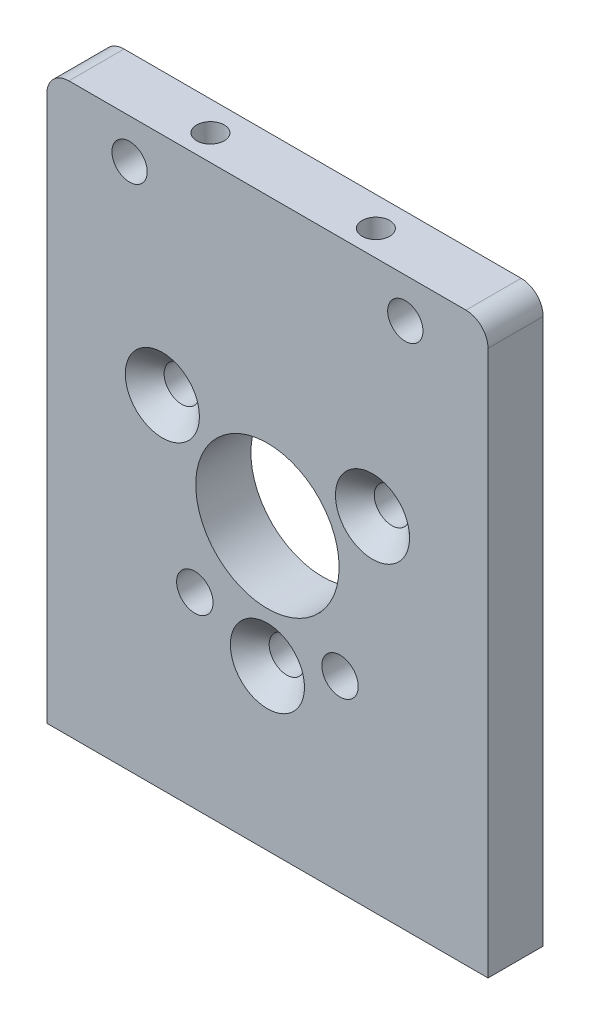
ISO-10303-21;
HEADER;
FILE_DESCRIPTION(('STEP AP214'),'2;1');
FILE_NAME('part.step','',(''),(''),'','','');
FILE_SCHEMA(('AUTOMOTIVE_DESIGN { 1 0 10303 214 1 1 1 1 }'));
ENDSEC;
DATA;
#1=APPLICATION_CONTEXT('core data for automotive mechanical design processes');
#2=APPLICATION_PROTOCOL_DEFINITION('international standard','automotive_design',2000,#1);
#3=PRODUCT_CONTEXT('',#1,'mechanical');
#4=PRODUCT('Part','Part','',(#3));
#5=PRODUCT_RELATED_PRODUCT_CATEGORY('part','',(#4));
#6=PRODUCT_DEFINITION_FORMATION('','',#4);
#7=PRODUCT_DEFINITION_CONTEXT('part definition',#1,'design');
#8=PRODUCT_DEFINITION('design','',#6,#7);
#9=PRODUCT_DEFINITION_SHAPE('','',#8);
#10=(LENGTH_UNIT() NAMED_UNIT(*) SI_UNIT(.MILLI.,.METRE.));
#11=(NAMED_UNIT(*) PLANE_ANGLE_UNIT() SI_UNIT($,.RADIAN.));
#12=(NAMED_UNIT(*) SI_UNIT($,.STERADIAN.) SOLID_ANGLE_UNIT());
#13=UNCERTAINTY_MEASURE_WITH_UNIT(LENGTH_MEASURE(1.E-05),#10,'distance_accuracy_value','');
#14=(GEOMETRIC_REPRESENTATION_CONTEXT(3) GLOBAL_UNCERTAINTY_ASSIGNED_CONTEXT((#13)) GLOBAL_UNIT_ASSIGNED_CONTEXT((#10,
#11,#12)) REPRESENTATION_CONTEXT('',''));
#15=CARTESIAN_POINT('',(0.,0.,0.));
#16=DIRECTION('',(0.,0.,1.));
#17=DIRECTION('',(1.,0.,0.));
#18=AXIS2_PLACEMENT_3D('',#15,#16,#17);
#19=CARTESIAN_POINT('',(-20.,51.4407699061603,5.));
#20=DIRECTION('',(0.,-1.,0.));
#21=DIRECTION('',(0.,0.,-1.));
#22=AXIS2_PLACEMENT_3D('',#19,#20,#21);
#23=PLANE('',#22);
#24=CARTESIAN_POINT('',(-7.5,51.4407699061603,2.66763659630348));
#25=DIRECTION('',(0.,1.,0.));
#26=DIRECTION('',(0.,0.,1.));
#27=AXIS2_PLACEMENT_3D('',#24,#25,#26);
#28=CIRCLE('',#27,1.25);
#29=CARTESIAN_POINT('',(-7.5,51.4407699061603,3.91763659630348));
#30=VERTEX_POINT('',#29);
#31=EDGE_CURVE('E118',#30,#30,#28,.T.);
#32=ORIENTED_EDGE('',*,*,#31,.F.);
#33=EDGE_LOOP('',(#32));
#34=FACE_BOUND('',#33,.T.);
#35=DIRECTION('',(-1.,0.,0.));
#36=VECTOR('',#35,1.);
#37=CARTESIAN_POINT('',(-20.,51.4407699061603,0.));
#38=LINE('',#37,#36);
#39=CARTESIAN_POINT('',(18.,51.4407699061603,0.));
#40=VERTEX_POINT('',#39);
#41=CARTESIAN_POINT('',(-18.,51.4407699061603,0.));
#42=VERTEX_POINT('',#41);
#43=EDGE_CURVE('E195',#40,#42,#38,.T.);
#44=ORIENTED_EDGE('',*,*,#43,.T.);
#45=DIRECTION('',(0.,0.,-1.));
#46=VECTOR('',#45,1.);
#47=CARTESIAN_POINT('',(-18.,51.4407699061603,5.));
#48=LINE('',#47,#46);
#49=CARTESIAN_POINT('',(-18.,51.4407699061603,5.));
#50=VERTEX_POINT('',#49);
#51=EDGE_CURVE('E63',#42,#50,#48,.F.);
#52=ORIENTED_EDGE('',*,*,#51,.T.);
#53=DIRECTION('',(-1.,0.,0.));
#54=VECTOR('',#53,1.);
#55=CARTESIAN_POINT('',(-20.,51.4407699061603,5.));
#56=LINE('',#55,#54);
#57=CARTESIAN_POINT('',(18.,51.4407699061603,5.));
#58=VERTEX_POINT('',#57);
#59=EDGE_CURVE('E198',#58,#50,#56,.T.);
#60=ORIENTED_EDGE('',*,*,#59,.F.);
#61=DIRECTION('',(0.,0.,-1.));
#62=VECTOR('',#61,1.);
#63=CARTESIAN_POINT('',(18.,51.4407699061603,5.));
#64=LINE('',#63,#62);
#65=EDGE_CURVE('E226',#58,#40,#64,.T.);
#66=ORIENTED_EDGE('',*,*,#65,.T.);
#67=EDGE_LOOP('',(#44,#52,#60,#66));
#68=FACE_BOUND('',#67,.T.);
#69=CARTESIAN_POINT('',(7.5,51.4407699061603,2.66763659630348));
#70=DIRECTION('',(0.,1.,0.));
#71=DIRECTION('',(0.,0.,1.));
#72=AXIS2_PLACEMENT_3D('',#69,#70,#71);
#73=CIRCLE('',#72,1.25);
#74=CARTESIAN_POINT('',(7.5,51.4407699061603,3.91763659630348));
#75=VERTEX_POINT('',#74);
#76=EDGE_CURVE('E117',#75,#75,#73,.T.);
#77=ORIENTED_EDGE('',*,*,#76,.F.);
#78=EDGE_LOOP('',(#77));
#79=FACE_BOUND('',#78,.T.);
#80=ADVANCED_FACE('F42',(#34,#68,#79),#23,.F.);
#81=CARTESIAN_POINT('',(-9.52627944162884,31.,5.));
#82=DIRECTION('',(0.,0.,-1.));
#83=DIRECTION('',(-1.,0.,0.));
#84=AXIS2_PLACEMENT_3D('',#81,#82,#83);
#85=CYLINDRICAL_SURFACE('',#84,1.6);
#86=CARTESIAN_POINT('',(-9.52627944162884,31.,0.));
#87=DIRECTION('',(0.,0.,1.));
#88=DIRECTION('',(1.,0.,0.));
#89=AXIS2_PLACEMENT_3D('',#86,#87,#88);
#90=CIRCLE('',#89,1.6);
#91=CARTESIAN_POINT('',(-7.92627944162884,31.,0.));
#92=VERTEX_POINT('',#91);
#93=EDGE_CURVE('E185',#92,#92,#90,.T.);
#94=ORIENTED_EDGE('',*,*,#93,.F.);
#95=EDGE_LOOP('',(#94));
#96=FACE_BOUND('',#95,.T.);
#97=CARTESIAN_POINT('',(-9.52627944162884,31.,3.24));
#98=DIRECTION('',(0.,0.,1.));
#99=DIRECTION('',(1.,0.,0.));
#100=AXIS2_PLACEMENT_3D('',#97,#98,#99);
#101=CIRCLE('',#100,1.6);
#102=CARTESIAN_POINT('',(-7.92627944162884,31.,3.24));
#103=VERTEX_POINT('',#102);
#104=EDGE_CURVE('E143',#103,#103,#101,.T.);
#105=ORIENTED_EDGE('',*,*,#104,.T.);
#106=EDGE_LOOP('',(#105));
#107=FACE_BOUND('',#106,.T.);
#108=ADVANCED_FACE('F271',(#96,#107),#85,.F.);
#109=CARTESIAN_POINT('',(9.52627944162884,31.,5.));
#110=DIRECTION('',(0.,0.,-1.));
#111=DIRECTION('',(-1.,0.,0.));
#112=AXIS2_PLACEMENT_3D('',#109,#110,#111);
#113=CYLINDRICAL_SURFACE('',#112,1.6);
#114=CARTESIAN_POINT('',(9.52627944162884,31.,0.));
#115=DIRECTION('',(0.,0.,1.));
#116=DIRECTION('',(-1.,0.,0.));
#117=AXIS2_PLACEMENT_3D('',#114,#115,#116);
#118=CIRCLE('',#117,1.6);
#119=CARTESIAN_POINT('',(7.92627944162884,31.,0.));
#120=VERTEX_POINT('',#119);
#121=EDGE_CURVE('E180',#120,#120,#118,.T.);
#122=ORIENTED_EDGE('',*,*,#121,.F.);
#123=EDGE_LOOP('',(#122));
#124=FACE_BOUND('',#123,.T.);
#125=CARTESIAN_POINT('',(9.52627944162884,31.,3.24));
#126=DIRECTION('',(0.,0.,1.));
#127=DIRECTION('',(1.,0.,0.));
#128=AXIS2_PLACEMENT_3D('',#125,#126,#127);
#129=CIRCLE('',#128,1.6);
#130=CARTESIAN_POINT('',(11.1262794416288,31.,3.24));
#131=VERTEX_POINT('',#130);
#132=EDGE_CURVE('E149',#131,#131,#129,.T.);
#133=ORIENTED_EDGE('',*,*,#132,.T.);
#134=EDGE_LOOP('',(#133));
#135=FACE_BOUND('',#134,.T.);
#136=ADVANCED_FACE('F277',(#124,#135),#113,.F.);
#137=CARTESIAN_POINT('',(0.,14.5,5.));
#138=DIRECTION('',(0.,0.,-1.));
#139=DIRECTION('',(-1.,0.,0.));
#140=AXIS2_PLACEMENT_3D('',#137,#138,#139);
#141=CYLINDRICAL_SURFACE('',#140,1.6);
#142=CARTESIAN_POINT('',(0.,14.5,0.));
#143=DIRECTION('',(0.,0.,1.));
#144=DIRECTION('',(1.,0.,0.));
#145=AXIS2_PLACEMENT_3D('',#142,#143,#144);
#146=CIRCLE('',#145,1.6);
#147=CARTESIAN_POINT('',(1.6,14.5,0.));
#148=VERTEX_POINT('',#147);
#149=EDGE_CURVE('E188',#148,#148,#146,.T.);
#150=ORIENTED_EDGE('',*,*,#149,.F.);
#151=EDGE_LOOP('',(#150));
#152=FACE_BOUND('',#151,.T.);
#153=CARTESIAN_POINT('',(0.,14.5,3.24));
#154=DIRECTION('',(0.,0.,1.));
#155=DIRECTION('',(1.,0.,0.));
#156=AXIS2_PLACEMENT_3D('',#153,#154,#155);
#157=CIRCLE('',#156,1.6);
#158=CARTESIAN_POINT('',(1.6,14.5,3.24));
#159=VERTEX_POINT('',#158);
#160=EDGE_CURVE('E155',#159,#159,#157,.T.);
#161=ORIENTED_EDGE('',*,*,#160,.T.);
#162=EDGE_LOOP('',(#161));
#163=FACE_BOUND('',#162,.T.);
#164=ADVANCED_FACE('F322',(#152,#163),#141,.F.);
#165=CARTESIAN_POINT('',(0.,0.,5.));
#166=DIRECTION('',(0.,0.,-1.));
#167=DIRECTION('',(-1.,0.,0.));
#168=AXIS2_PLACEMENT_3D('',#165,#166,#167);
#169=PLANE('',#168);
#170=CARTESIAN_POINT('',(-9.52627944162884,31.,5.));
#171=DIRECTION('',(0.,0.,1.));
#172=DIRECTION('',(1.,0.,0.));
#173=AXIS2_PLACEMENT_3D('',#170,#171,#172);
#174=CIRCLE('',#173,3.36);
#175=CARTESIAN_POINT('',(-6.16627944162884,31.,5.));
#176=VERTEX_POINT('',#175);
#177=EDGE_CURVE('E140',#176,#176,#174,.T.);
#178=ORIENTED_EDGE('',*,*,#177,.F.);
#179=EDGE_LOOP('',(#178));
#180=FACE_BOUND('',#179,.T.);
#181=CARTESIAN_POINT('',(9.52627944162884,31.,5.));
#182=DIRECTION('',(0.,0.,1.));
#183=DIRECTION('',(1.,0.,0.));
#184=AXIS2_PLACEMENT_3D('',#181,#182,#183);
#185=CIRCLE('',#184,3.36);
#186=CARTESIAN_POINT('',(12.8862794416288,31.,5.));
#187=VERTEX_POINT('',#186);
#188=EDGE_CURVE('E146',#187,#187,#185,.T.);
#189=ORIENTED_EDGE('',*,*,#188,.F.);
#190=EDGE_LOOP('',(#189));
#191=FACE_BOUND('',#190,.T.);
#192=CARTESIAN_POINT('',(0.,14.5,5.));
#193=DIRECTION('',(0.,0.,1.));
#194=DIRECTION('',(1.,0.,0.));
#195=AXIS2_PLACEMENT_3D('',#192,#193,#194);
#196=CIRCLE('',#195,3.36);
#197=CARTESIAN_POINT('',(3.36,14.5,5.));
#198=VERTEX_POINT('',#197);
#199=EDGE_CURVE('E152',#198,#198,#196,.T.);
#200=ORIENTED_EDGE('',*,*,#199,.F.);
#201=EDGE_LOOP('',(#200));
#202=FACE_BOUND('',#201,.T.);
#203=CARTESIAN_POINT('',(6.58122329054409,17.,5.));
#204=DIRECTION('',(0.,0.,-1.));
#205=DIRECTION('',(-1.,0.,0.));
#206=AXIS2_PLACEMENT_3D('',#203,#204,#205);
#207=CIRCLE('',#206,1.64999999999999);
#208=CARTESIAN_POINT('',(4.9312232905441,17.,5.));
#209=VERTEX_POINT('',#208);
#210=EDGE_CURVE('E161',#209,#209,#207,.T.);
#211=ORIENTED_EDGE('',*,*,#210,.T.);
#212=EDGE_LOOP('',(#211));
#213=FACE_BOUND('',#212,.T.);
#214=CARTESIAN_POINT('',(-6.58122329054409,17.,5.));
#215=DIRECTION('',(0.,0.,-1.));
#216=DIRECTION('',(-1.,0.,0.));
#217=AXIS2_PLACEMENT_3D('',#214,#215,#216);
#218=CIRCLE('',#217,1.64999999999999);
#219=CARTESIAN_POINT('',(-8.23122329054408,17.,5.));
#220=VERTEX_POINT('',#219);
#221=EDGE_CURVE('E167',#220,#220,#218,.T.);
#222=ORIENTED_EDGE('',*,*,#221,.T.);
#223=EDGE_LOOP('',(#222));
#224=FACE_BOUND('',#223,.T.);
#225=ORIENTED_EDGE('',*,*,#59,.T.);
#226=CARTESIAN_POINT('',(-18.,49.4407699061603,5.));
#227=DIRECTION('',(0.,0.,-1.));
#228=DIRECTION('',(-1.,0.,0.));
#229=AXIS2_PLACEMENT_3D('',#226,#227,#228);
#230=CIRCLE('',#229,2.);
#231=CARTESIAN_POINT('',(-20.,49.4407699061603,5.));
#232=VERTEX_POINT('',#231);
#233=EDGE_CURVE('E50',#50,#232,#230,.F.);
#234=ORIENTED_EDGE('',*,*,#233,.T.);
#235=DIRECTION('',(0.,-1.,0.));
#236=VECTOR('',#235,1.);
#237=CARTESIAN_POINT('',(-20.,51.4407699061603,5.));
#238=LINE('',#237,#236);
#239=CARTESIAN_POINT('',(-20.,0.,5.));
#240=VERTEX_POINT('',#239);
#241=EDGE_CURVE('E200',#232,#240,#238,.T.);
#242=ORIENTED_EDGE('',*,*,#241,.T.);
#243=DIRECTION('',(1.,0.,0.));
#244=VECTOR('',#243,1.);
#245=CARTESIAN_POINT('',(-20.,0.,5.));
#246=LINE('',#245,#244);
#247=CARTESIAN_POINT('',(20.,0.,5.));
#248=VERTEX_POINT('',#247);
#249=EDGE_CURVE('E203',#240,#248,#246,.T.);
#250=ORIENTED_EDGE('',*,*,#249,.T.);
#251=DIRECTION('',(0.,1.,0.));
#252=VECTOR('',#251,1.);
#253=CARTESIAN_POINT('',(20.,51.4407699061603,5.));
#254=LINE('',#253,#252);
#255=CARTESIAN_POINT('',(20.,49.4407699061603,5.));
#256=VERTEX_POINT('',#255);
#257=EDGE_CURVE('E205',#248,#256,#254,.T.);
#258=ORIENTED_EDGE('',*,*,#257,.T.);
#259=CARTESIAN_POINT('',(18.,49.4407699061603,5.));
#260=DIRECTION('',(0.,0.,-1.));
#261=DIRECTION('',(-1.,0.,0.));
#262=AXIS2_PLACEMENT_3D('',#259,#260,#261);
#263=CIRCLE('',#262,2.);
#264=EDGE_CURVE('E230',#256,#58,#263,.F.);
#265=ORIENTED_EDGE('',*,*,#264,.T.);
#266=EDGE_LOOP('',(#225,#234,#242,#250,#258,#265));
#267=FACE_BOUND('',#266,.T.);
#268=CARTESIAN_POINT('',(0.,25.5,5.));
#269=DIRECTION('',(0.,0.,1.));
#270=DIRECTION('',(1.,0.,0.));
#271=AXIS2_PLACEMENT_3D('',#268,#269,#270);
#272=CIRCLE('',#271,6.5);
#273=CARTESIAN_POINT('',(6.50000000000001,25.5,5.));
#274=VERTEX_POINT('',#273);
#275=EDGE_CURVE('E192',#274,#274,#272,.T.);
#276=ORIENTED_EDGE('',*,*,#275,.F.);
#277=EDGE_LOOP('',(#276));
#278=FACE_BOUND('',#277,.T.);
#279=CARTESIAN_POINT('',(-12.5,47.8407699061604,5.));
#280=DIRECTION('',(0.,0.,1.));
#281=DIRECTION('',(1.,0.,0.));
#282=AXIS2_PLACEMENT_3D('',#279,#280,#281);
#283=CIRCLE('',#282,1.6);
#284=CARTESIAN_POINT('',(-10.9,47.8407699061604,5.));
#285=VERTEX_POINT('',#284);
#286=EDGE_CURVE('E177',#285,#285,#283,.T.);
#287=ORIENTED_EDGE('',*,*,#286,.F.);
#288=EDGE_LOOP('',(#287));
#289=FACE_BOUND('',#288,.T.);
#290=CARTESIAN_POINT('',(12.5,47.8407699061604,5.));
#291=DIRECTION('',(0.,0.,1.));
#292=DIRECTION('',(-1.,0.,0.));
#293=AXIS2_PLACEMENT_3D('',#290,#291,#292);
#294=CIRCLE('',#293,1.6);
#295=CARTESIAN_POINT('',(10.9,47.8407699061604,5.));
#296=VERTEX_POINT('',#295);
#297=EDGE_CURVE('E171',#296,#296,#294,.T.);
#298=ORIENTED_EDGE('',*,*,#297,.F.);
#299=EDGE_LOOP('',(#298));
#300=FACE_BOUND('',#299,.T.);
#301=ADVANCED_FACE('F234',(#180,#191,#202,#213,#224,#267,#278,#289,#300),#169,.F.);
#302=CARTESIAN_POINT('',(0.,0.,0.));
#303=DIRECTION('',(0.,0.,-1.));
#304=DIRECTION('',(-1.,0.,0.));
#305=AXIS2_PLACEMENT_3D('',#302,#303,#304);
#306=PLANE('',#305);
#307=CARTESIAN_POINT('',(6.58122329054409,17.,0.));
#308=DIRECTION('',(0.,0.,-1.));
#309=DIRECTION('',(-1.,0.,0.));
#310=AXIS2_PLACEMENT_3D('',#307,#308,#309);
#311=CIRCLE('',#310,1.64999999999999);
#312=CARTESIAN_POINT('',(4.9312232905441,17.,0.));
#313=VERTEX_POINT('',#312);
#314=EDGE_CURVE('E158',#313,#313,#311,.T.);
#315=ORIENTED_EDGE('',*,*,#314,.F.);
#316=EDGE_LOOP('',(#315));
#317=FACE_BOUND('',#316,.T.);
#318=CARTESIAN_POINT('',(-6.58122329054409,17.,0.));
#319=DIRECTION('',(0.,0.,-1.));
#320=DIRECTION('',(-1.,0.,0.));
#321=AXIS2_PLACEMENT_3D('',#318,#319,#320);
#322=CIRCLE('',#321,1.64999999999999);
#323=CARTESIAN_POINT('',(-8.23122329054408,17.,0.));
#324=VERTEX_POINT('',#323);
#325=EDGE_CURVE('E164',#324,#324,#322,.T.);
#326=ORIENTED_EDGE('',*,*,#325,.F.);
#327=EDGE_LOOP('',(#326));
#328=FACE_BOUND('',#327,.T.);
#329=CARTESIAN_POINT('',(-12.5,47.8407699061604,0.));
#330=DIRECTION('',(0.,0.,1.));
#331=DIRECTION('',(1.,0.,0.));
#332=AXIS2_PLACEMENT_3D('',#329,#330,#331);
#333=CIRCLE('',#332,1.6);
#334=CARTESIAN_POINT('',(-10.9,47.8407699061604,0.));
#335=VERTEX_POINT('',#334);
#336=EDGE_CURVE('E174',#335,#335,#333,.T.);
#337=ORIENTED_EDGE('',*,*,#336,.T.);
#338=EDGE_LOOP('',(#337));
#339=FACE_BOUND('',#338,.T.);
#340=ORIENTED_EDGE('',*,*,#93,.T.);
#341=EDGE_LOOP('',(#340));
#342=FACE_BOUND('',#341,.T.);
#343=CARTESIAN_POINT('',(0.,25.5,0.));
#344=DIRECTION('',(0.,0.,1.));
#345=DIRECTION('',(1.,0.,0.));
#346=AXIS2_PLACEMENT_3D('',#343,#344,#345);
#347=CIRCLE('',#346,6.5);
#348=CARTESIAN_POINT('',(6.50000000000001,25.5,0.));
#349=VERTEX_POINT('',#348);
#350=EDGE_CURVE('E191',#349,#349,#347,.T.);
#351=ORIENTED_EDGE('',*,*,#350,.T.);
#352=EDGE_LOOP('',(#351));
#353=FACE_BOUND('',#352,.T.);
#354=DIRECTION('',(0.,-1.,0.));
#355=VECTOR('',#354,1.);
#356=CARTESIAN_POINT('',(-20.,51.4407699061603,0.));
#357=LINE('',#356,#355);
#358=CARTESIAN_POINT('',(-20.,49.4407699061603,0.));
#359=VERTEX_POINT('',#358);
#360=CARTESIAN_POINT('',(-20.,0.,0.));
#361=VERTEX_POINT('',#360);
#362=EDGE_CURVE('E209',#359,#361,#357,.T.);
#363=ORIENTED_EDGE('',*,*,#362,.F.);
#364=CARTESIAN_POINT('',(-18.,49.4407699061603,0.));
#365=DIRECTION('',(0.,0.,-1.));
#366=DIRECTION('',(-1.,0.,0.));
#367=AXIS2_PLACEMENT_3D('',#364,#365,#366);
#368=CIRCLE('',#367,2.);
#369=EDGE_CURVE('E224',#359,#42,#368,.T.);
#370=ORIENTED_EDGE('',*,*,#369,.T.);
#371=ORIENTED_EDGE('',*,*,#43,.F.);
#372=CARTESIAN_POINT('',(18.,49.4407699061603,0.));
#373=DIRECTION('',(0.,0.,-1.));
#374=DIRECTION('',(-1.,0.,0.));
#375=AXIS2_PLACEMENT_3D('',#372,#373,#374);
#376=CIRCLE('',#375,2.);
#377=CARTESIAN_POINT('',(20.,49.4407699061603,0.));
#378=VERTEX_POINT('',#377);
#379=EDGE_CURVE('E222',#40,#378,#376,.T.);
#380=ORIENTED_EDGE('',*,*,#379,.T.);
#381=DIRECTION('',(0.,1.,0.));
#382=VECTOR('',#381,1.);
#383=CARTESIAN_POINT('',(20.,51.4407699061603,0.));
#384=LINE('',#383,#382);
#385=CARTESIAN_POINT('',(20.,0.,0.));
#386=VERTEX_POINT('',#385);
#387=EDGE_CURVE('E201',#386,#378,#384,.T.);
#388=ORIENTED_EDGE('',*,*,#387,.F.);
#389=DIRECTION('',(1.,0.,0.));
#390=VECTOR('',#389,1.);
#391=CARTESIAN_POINT('',(-20.,0.,0.));
#392=LINE('',#391,#390);
#393=EDGE_CURVE('E211',#361,#386,#392,.T.);
#394=ORIENTED_EDGE('',*,*,#393,.F.);
#395=EDGE_LOOP('',(#363,#370,#371,#380,#388,#394));
#396=FACE_BOUND('',#395,.T.);
#397=ORIENTED_EDGE('',*,*,#149,.T.);
#398=EDGE_LOOP('',(#397));
#399=FACE_BOUND('',#398,.T.);
#400=ORIENTED_EDGE('',*,*,#121,.T.);
#401=EDGE_LOOP('',(#400));
#402=FACE_BOUND('',#401,.T.);
#403=CARTESIAN_POINT('',(12.5,47.8407699061604,0.));
#404=DIRECTION('',(0.,0.,1.));
#405=DIRECTION('',(-1.,0.,0.));
#406=AXIS2_PLACEMENT_3D('',#403,#404,#405);
#407=CIRCLE('',#406,1.6);
#408=CARTESIAN_POINT('',(10.9,47.8407699061604,0.));
#409=VERTEX_POINT('',#408);
#410=EDGE_CURVE('E170',#409,#409,#407,.T.);
#411=ORIENTED_EDGE('',*,*,#410,.T.);
#412=EDGE_LOOP('',(#411));
#413=FACE_BOUND('',#412,.T.);
#414=ADVANCED_FACE('F246',(#317,#328,#339,#342,#353,#396,#399,#402,#413),#306,.T.);
#415=CARTESIAN_POINT('',(-20.,51.4407699061603,5.));
#416=DIRECTION('',(1.,0.,0.));
#417=DIRECTION('',(0.,1.,0.));
#418=AXIS2_PLACEMENT_3D('',#415,#416,#417);
#419=PLANE('',#418);
#420=ORIENTED_EDGE('',*,*,#241,.F.);
#421=DIRECTION('',(0.,0.,-1.));
#422=VECTOR('',#421,1.);
#423=CARTESIAN_POINT('',(-20.,49.4407699061603,5.));
#424=LINE('',#423,#422);
#425=EDGE_CURVE('E219',#232,#359,#424,.T.);
#426=ORIENTED_EDGE('',*,*,#425,.T.);
#427=ORIENTED_EDGE('',*,*,#362,.T.);
#428=DIRECTION('',(0.,0.,-1.));
#429=VECTOR('',#428,1.);
#430=CARTESIAN_POINT('',(-20.,0.,5.));
#431=LINE('',#430,#429);
#432=EDGE_CURVE('E216',#240,#361,#431,.T.);
#433=ORIENTED_EDGE('',*,*,#432,.F.);
#434=EDGE_LOOP('',(#420,#426,#427,#433));
#435=FACE_BOUND('',#434,.T.);
#436=ADVANCED_FACE('F240',(#435),#419,.F.);
#437=CARTESIAN_POINT('',(-20.,0.,5.));
#438=DIRECTION('',(0.,1.,0.));
#439=DIRECTION('',(0.,0.,1.));
#440=AXIS2_PLACEMENT_3D('',#437,#438,#439);
#441=PLANE('',#440);
#442=CARTESIAN_POINT('',(-16.,0.,2.5));
#443=DIRECTION('',(0.,-1.,0.));
#444=DIRECTION('',(0.,0.,-1.));
#445=AXIS2_PLACEMENT_3D('',#442,#443,#444);
#446=CIRCLE('',#445,1.25);
#447=CARTESIAN_POINT('',(-16.,0.,1.25));
#448=VERTEX_POINT('',#447);
#449=EDGE_CURVE('E128',#448,#448,#446,.T.);
#450=ORIENTED_EDGE('',*,*,#449,.F.);
#451=EDGE_LOOP('',(#450));
#452=FACE_BOUND('',#451,.T.);
#453=CARTESIAN_POINT('',(16.,0.,2.5));
#454=DIRECTION('',(0.,-1.,0.));
#455=DIRECTION('',(0.,0.,-1.));
#456=AXIS2_PLACEMENT_3D('',#453,#454,#455);
#457=CIRCLE('',#456,1.25);
#458=CARTESIAN_POINT('',(16.,0.,1.25));
#459=VERTEX_POINT('',#458);
#460=EDGE_CURVE('E134',#459,#459,#457,.T.);
#461=ORIENTED_EDGE('',*,*,#460,.F.);
#462=EDGE_LOOP('',(#461));
#463=FACE_BOUND('',#462,.T.);
#464=ORIENTED_EDGE('',*,*,#393,.T.);
#465=DIRECTION('',(0.,0.,-1.));
#466=VECTOR('',#465,1.);
#467=CARTESIAN_POINT('',(20.,0.,5.));
#468=LINE('',#467,#466);
#469=EDGE_CURVE('E207',#248,#386,#468,.T.);
#470=ORIENTED_EDGE('',*,*,#469,.F.);
#471=ORIENTED_EDGE('',*,*,#249,.F.);
#472=ORIENTED_EDGE('',*,*,#432,.T.);
#473=EDGE_LOOP('',(#464,#470,#471,#472));
#474=FACE_BOUND('',#473,.T.);
#475=ADVANCED_FACE('F257',(#452,#463,#474),#441,.F.);
#476=CARTESIAN_POINT('',(20.,51.4407699061603,5.));
#477=DIRECTION('',(-1.,0.,0.));
#478=DIRECTION('',(0.,-1.,0.));
#479=AXIS2_PLACEMENT_3D('',#476,#477,#478);
#480=PLANE('',#479);
#481=ORIENTED_EDGE('',*,*,#387,.T.);
#482=DIRECTION('',(0.,0.,-1.));
#483=VECTOR('',#482,1.);
#484=CARTESIAN_POINT('',(20.,49.4407699061603,5.));
#485=LINE('',#484,#483);
#486=EDGE_CURVE('E11',#378,#256,#485,.F.);
#487=ORIENTED_EDGE('',*,*,#486,.T.);
#488=ORIENTED_EDGE('',*,*,#257,.F.);
#489=ORIENTED_EDGE('',*,*,#469,.T.);
#490=EDGE_LOOP('',(#481,#487,#488,#489));
#491=FACE_BOUND('',#490,.T.);
#492=ADVANCED_FACE('F254',(#491),#480,.F.);
#493=CARTESIAN_POINT('',(0.,25.5,5.));
#494=DIRECTION('',(0.,0.,-1.));
#495=DIRECTION('',(-1.,0.,0.));
#496=AXIS2_PLACEMENT_3D('',#493,#494,#495);
#497=CYLINDRICAL_SURFACE('',#496,6.5);
#498=ORIENTED_EDGE('',*,*,#275,.T.);
#499=EDGE_LOOP('',(#498));
#500=FACE_BOUND('',#499,.T.);
#501=ORIENTED_EDGE('',*,*,#350,.F.);
#502=EDGE_LOOP('',(#501));
#503=FACE_BOUND('',#502,.T.);
#504=ADVANCED_FACE('F265',(#500,#503),#497,.F.);
#505=CARTESIAN_POINT('',(-12.5,47.8407699061604,5.));
#506=DIRECTION('',(0.,0.,-1.));
#507=DIRECTION('',(-1.,0.,0.));
#508=AXIS2_PLACEMENT_3D('',#505,#506,#507);
#509=CYLINDRICAL_SURFACE('',#508,1.6);
#510=ORIENTED_EDGE('',*,*,#286,.T.);
#511=EDGE_LOOP('',(#510));
#512=FACE_BOUND('',#511,.T.);
#513=ORIENTED_EDGE('',*,*,#336,.F.);
#514=EDGE_LOOP('',(#513));
#515=FACE_BOUND('',#514,.T.);
#516=ADVANCED_FACE('F316',(#512,#515),#509,.F.);
#517=CARTESIAN_POINT('',(12.5,47.8407699061604,5.));
#518=DIRECTION('',(0.,0.,-1.));
#519=DIRECTION('',(-1.,0.,0.));
#520=AXIS2_PLACEMENT_3D('',#517,#518,#519);
#521=CYLINDRICAL_SURFACE('',#520,1.6);
#522=ORIENTED_EDGE('',*,*,#297,.T.);
#523=EDGE_LOOP('',(#522));
#524=FACE_BOUND('',#523,.T.);
#525=ORIENTED_EDGE('',*,*,#410,.F.);
#526=EDGE_LOOP('',(#525));
#527=FACE_BOUND('',#526,.T.);
#528=ADVANCED_FACE('F312',(#524,#527),#521,.F.);
#529=CARTESIAN_POINT('',(-6.58122329054409,17.,0.));
#530=DIRECTION('',(0.,0.,-1.));
#531=DIRECTION('',(-1.,0.,0.));
#532=AXIS2_PLACEMENT_3D('',#529,#530,#531);
#533=CYLINDRICAL_SURFACE('',#532,1.64999999999999);
#534=ORIENTED_EDGE('',*,*,#221,.F.);
#535=EDGE_LOOP('',(#534));
#536=FACE_BOUND('',#535,.T.);
#537=ORIENTED_EDGE('',*,*,#325,.T.);
#538=EDGE_LOOP('',(#537));
#539=FACE_BOUND('',#538,.T.);
#540=ADVANCED_FACE('F308',(#536,#539),#533,.F.);
#541=CARTESIAN_POINT('',(6.58122329054409,17.,0.));
#542=DIRECTION('',(0.,0.,-1.));
#543=DIRECTION('',(-1.,0.,0.));
#544=AXIS2_PLACEMENT_3D('',#541,#542,#543);
#545=CYLINDRICAL_SURFACE('',#544,1.64999999999999);
#546=ORIENTED_EDGE('',*,*,#210,.F.);
#547=EDGE_LOOP('',(#546));
#548=FACE_BOUND('',#547,.T.);
#549=ORIENTED_EDGE('',*,*,#314,.T.);
#550=EDGE_LOOP('',(#549));
#551=FACE_BOUND('',#550,.T.);
#552=ADVANCED_FACE('F304',(#548,#551),#545,.F.);
#553=CARTESIAN_POINT('',(0.,14.5,5.));
#554=DIRECTION('',(0.,0.,1.));
#555=DIRECTION('',(1.,0.,0.));
#556=AXIS2_PLACEMENT_3D('',#553,#554,#555);
#557=CONICAL_SURFACE('',#556,3.36,0.785398163397449);
#558=ORIENTED_EDGE('',*,*,#160,.F.);
#559=EDGE_LOOP('',(#558));
#560=FACE_BOUND('',#559,.T.);
#561=ORIENTED_EDGE('',*,*,#199,.T.);
#562=EDGE_LOOP('',(#561));
#563=FACE_BOUND('',#562,.T.);
#564=ADVANCED_FACE('F294',(#560,#563),#557,.F.);
#565=CARTESIAN_POINT('',(9.52627944162884,31.,5.));
#566=DIRECTION('',(0.,0.,1.));
#567=DIRECTION('',(1.,0.,0.));
#568=AXIS2_PLACEMENT_3D('',#565,#566,#567);
#569=CONICAL_SURFACE('',#568,3.36,0.785398163397449);
#570=ORIENTED_EDGE('',*,*,#132,.F.);
#571=EDGE_LOOP('',(#570));
#572=FACE_BOUND('',#571,.T.);
#573=ORIENTED_EDGE('',*,*,#188,.T.);
#574=EDGE_LOOP('',(#573));
#575=FACE_BOUND('',#574,.T.);
#576=ADVANCED_FACE('F288',(#572,#575),#569,.F.);
#577=CARTESIAN_POINT('',(-9.52627944162884,31.,5.));
#578=DIRECTION('',(0.,0.,1.));
#579=DIRECTION('',(1.,0.,0.));
#580=AXIS2_PLACEMENT_3D('',#577,#578,#579);
#581=CONICAL_SURFACE('',#580,3.36,0.785398163397449);
#582=ORIENTED_EDGE('',*,*,#104,.F.);
#583=EDGE_LOOP('',(#582));
#584=FACE_BOUND('',#583,.T.);
#585=ORIENTED_EDGE('',*,*,#177,.T.);
#586=EDGE_LOOP('',(#585));
#587=FACE_BOUND('',#586,.T.);
#588=ADVANCED_FACE('F282',(#584,#587),#581,.F.);
#589=CARTESIAN_POINT('',(-18.,49.4407699061603,5.));
#590=DIRECTION('',(0.,0.,-1.));
#591=DIRECTION('',(-1.,0.,0.));
#592=AXIS2_PLACEMENT_3D('',#589,#590,#591);
#593=CYLINDRICAL_SURFACE('',#592,2.);
#594=ORIENTED_EDGE('',*,*,#233,.F.);
#595=ORIENTED_EDGE('',*,*,#51,.F.);
#596=ORIENTED_EDGE('',*,*,#369,.F.);
#597=ORIENTED_EDGE('',*,*,#425,.F.);
#598=EDGE_LOOP('',(#594,#595,#596,#597));
#599=FACE_BOUND('',#598,.T.);
#600=ADVANCED_FACE('F243',(#599),#593,.T.);
#601=CARTESIAN_POINT('',(18.,49.4407699061603,5.));
#602=DIRECTION('',(0.,0.,-1.));
#603=DIRECTION('',(-1.,0.,0.));
#604=AXIS2_PLACEMENT_3D('',#601,#602,#603);
#605=CYLINDRICAL_SURFACE('',#604,2.);
#606=ORIENTED_EDGE('',*,*,#264,.F.);
#607=ORIENTED_EDGE('',*,*,#486,.F.);
#608=ORIENTED_EDGE('',*,*,#379,.F.);
#609=ORIENTED_EDGE('',*,*,#65,.F.);
#610=EDGE_LOOP('',(#606,#607,#608,#609));
#611=FACE_BOUND('',#610,.T.);
#612=ADVANCED_FACE('F44',(#611),#605,.T.);
#613=CARTESIAN_POINT('',(16.,16.,2.5));
#614=DIRECTION('',(0.,-1.,0.));
#615=DIRECTION('',(0.,0.,-1.));
#616=AXIS2_PLACEMENT_3D('',#613,#614,#615);
#617=CONICAL_SURFACE('',#616,1.25,1.02974425867665);
#618=CARTESIAN_POINT('',(16.,16.7510757737845,2.5));
#619=VERTEX_POINT('',#618);
#620=VERTEX_LOOP('',#619);
#621=FACE_BOUND('',#620,.T.);
#622=CARTESIAN_POINT('',(16.,16.,2.5));
#623=DIRECTION('',(0.,-1.,0.));
#624=DIRECTION('',(0.,0.,-1.));
#625=AXIS2_PLACEMENT_3D('',#622,#623,#624);
#626=CIRCLE('',#625,1.25);
#627=CARTESIAN_POINT('',(16.,16.,1.25));
#628=VERTEX_POINT('',#627);
#629=EDGE_CURVE('E137',#628,#628,#626,.T.);
#630=ORIENTED_EDGE('',*,*,#629,.T.);
#631=EDGE_LOOP('',(#630));
#632=FACE_BOUND('',#631,.T.);
#633=ADVANCED_FACE('F287',(#621,#632),#617,.F.);
#634=CARTESIAN_POINT('',(16.,0.,2.5));
#635=DIRECTION('',(0.,-1.,0.));
#636=DIRECTION('',(0.,0.,-1.));
#637=AXIS2_PLACEMENT_3D('',#634,#635,#636);
#638=CYLINDRICAL_SURFACE('',#637,1.25);
#639=ORIENTED_EDGE('',*,*,#629,.F.);
#640=EDGE_LOOP('',(#639));
#641=FACE_BOUND('',#640,.T.);
#642=ORIENTED_EDGE('',*,*,#460,.T.);
#643=EDGE_LOOP('',(#642));
#644=FACE_BOUND('',#643,.T.);
#645=ADVANCED_FACE('F395',(#641,#644),#638,.F.);
#646=CARTESIAN_POINT('',(-16.,16.,2.5));
#647=DIRECTION('',(0.,-1.,0.));
#648=DIRECTION('',(0.,0.,-1.));
#649=AXIS2_PLACEMENT_3D('',#646,#647,#648);
#650=CONICAL_SURFACE('',#649,1.25,1.02974425867665);
#651=CARTESIAN_POINT('',(-16.,16.7510757737845,2.5));
#652=VERTEX_POINT('',#651);
#653=VERTEX_LOOP('',#652);
#654=FACE_BOUND('',#653,.T.);
#655=CARTESIAN_POINT('',(-16.,16.,2.5));
#656=DIRECTION('',(0.,-1.,0.));
#657=DIRECTION('',(0.,0.,-1.));
#658=AXIS2_PLACEMENT_3D('',#655,#656,#657);
#659=CIRCLE('',#658,1.25);
#660=CARTESIAN_POINT('',(-16.,16.,1.25));
#661=VERTEX_POINT('',#660);
#662=EDGE_CURVE('E131',#661,#661,#659,.T.);
#663=ORIENTED_EDGE('',*,*,#662,.T.);
#664=EDGE_LOOP('',(#663));
#665=FACE_BOUND('',#664,.T.);
#666=ADVANCED_FACE('F405',(#654,#665),#650,.F.);
#667=CARTESIAN_POINT('',(-16.,0.,2.5));
#668=DIRECTION('',(0.,-1.,0.));
#669=DIRECTION('',(0.,0.,-1.));
#670=AXIS2_PLACEMENT_3D('',#667,#668,#669);
#671=CYLINDRICAL_SURFACE('',#670,1.25);
#672=ORIENTED_EDGE('',*,*,#662,.F.);
#673=EDGE_LOOP('',(#672));
#674=FACE_BOUND('',#673,.T.);
#675=ORIENTED_EDGE('',*,*,#449,.T.);
#676=EDGE_LOOP('',(#675));
#677=FACE_BOUND('',#676,.T.);
#678=ADVANCED_FACE('F416',(#674,#677),#671,.F.);
#679=CARTESIAN_POINT('',(7.5,46.1918456799448,2.66763659630348));
#680=DIRECTION('',(0.,1.,0.));
#681=DIRECTION('',(0.,0.,1.));
#682=AXIS2_PLACEMENT_3D('',#679,#680,#681);
#683=CONICAL_SURFACE('',#682,1.25,1.02974425867665);
#684=CARTESIAN_POINT('',(7.5,45.4407699061603,2.66763659630348));
#685=VERTEX_POINT('',#684);
#686=VERTEX_LOOP('',#685);
#687=FACE_BOUND('',#686,.T.);
#688=CARTESIAN_POINT('',(7.5,46.1918456799448,2.66763659630348));
#689=DIRECTION('',(0.,1.,0.));
#690=DIRECTION('',(0.,0.,1.));
#691=AXIS2_PLACEMENT_3D('',#688,#689,#690);
#692=CIRCLE('',#691,1.25);
#693=CARTESIAN_POINT('',(7.5,46.1918456799448,3.91763659630347));
#694=VERTEX_POINT('',#693);
#695=EDGE_CURVE('E121',#694,#694,#692,.T.);
#696=ORIENTED_EDGE('',*,*,#695,.T.);
#697=EDGE_LOOP('',(#696));
#698=FACE_BOUND('',#697,.T.);
#699=ADVANCED_FACE('F426',(#687,#698),#683,.F.);
#700=CARTESIAN_POINT('',(7.5,51.4407699061603,2.66763659630348));
#701=DIRECTION('',(0.,1.,0.));
#702=DIRECTION('',(0.,0.,1.));
#703=AXIS2_PLACEMENT_3D('',#700,#701,#702);
#704=CYLINDRICAL_SURFACE('',#703,1.25);
#705=ORIENTED_EDGE('',*,*,#695,.F.);
#706=EDGE_LOOP('',(#705));
#707=FACE_BOUND('',#706,.T.);
#708=ORIENTED_EDGE('',*,*,#76,.T.);
#709=EDGE_LOOP('',(#708));
#710=FACE_BOUND('',#709,.T.);
#711=ADVANCED_FACE('F111',(#707,#710),#704,.F.);
#712=CARTESIAN_POINT('',(-7.5,46.1918456799448,2.66763659630348));
#713=DIRECTION('',(0.,1.,0.));
#714=DIRECTION('',(0.,0.,1.));
#715=AXIS2_PLACEMENT_3D('',#712,#713,#714);
#716=CONICAL_SURFACE('',#715,1.25,1.02974425867665);
#717=CARTESIAN_POINT('',(-7.5,45.4407699061603,2.66763659630348));
#718=VERTEX_POINT('',#717);
#719=VERTEX_LOOP('',#718);
#720=FACE_BOUND('',#719,.T.);
#721=CARTESIAN_POINT('',(-7.5,46.1918456799448,2.66763659630348));
#722=DIRECTION('',(0.,1.,0.));
#723=DIRECTION('',(0.,0.,1.));
#724=AXIS2_PLACEMENT_3D('',#721,#722,#723);
#725=CIRCLE('',#724,1.25);
#726=CARTESIAN_POINT('',(-7.5,46.1918456799448,3.91763659630347));
#727=VERTEX_POINT('',#726);
#728=EDGE_CURVE('E115',#727,#727,#725,.T.);
#729=ORIENTED_EDGE('',*,*,#728,.T.);
#730=EDGE_LOOP('',(#729));
#731=FACE_BOUND('',#730,.T.);
#732=ADVANCED_FACE('F107',(#720,#731),#716,.F.);
#733=CARTESIAN_POINT('',(-7.5,51.4407699061603,2.66763659630348));
#734=DIRECTION('',(0.,1.,0.));
#735=DIRECTION('',(0.,0.,1.));
#736=AXIS2_PLACEMENT_3D('',#733,#734,#735);
#737=CYLINDRICAL_SURFACE('',#736,1.25);
#738=ORIENTED_EDGE('',*,*,#728,.F.);
#739=EDGE_LOOP('',(#738));
#740=FACE_BOUND('',#739,.T.);
#741=ORIENTED_EDGE('',*,*,#31,.T.);
#742=EDGE_LOOP('',(#741));
#743=FACE_BOUND('',#742,.T.);
#744=ADVANCED_FACE('F110',(#740,#743),#737,.F.);
#745=CLOSED_SHELL('',(#80,#108,#136,#164,#301,#414,#436,#475,#492,#504,#516,#528,#540,#552,#564,
#576,#588,#600,#612,#633,#645,#666,#678,#699,#711,#732,#744));
#746=MANIFOLD_SOLID_BREP('B2',#745);
#747=ADVANCED_BREP_SHAPE_REPRESENTATION('',(#18,#746),#14);
#748=SHAPE_DEFINITION_REPRESENTATION(#9,#747);
ENDSEC;
END-ISO-10303-21;
